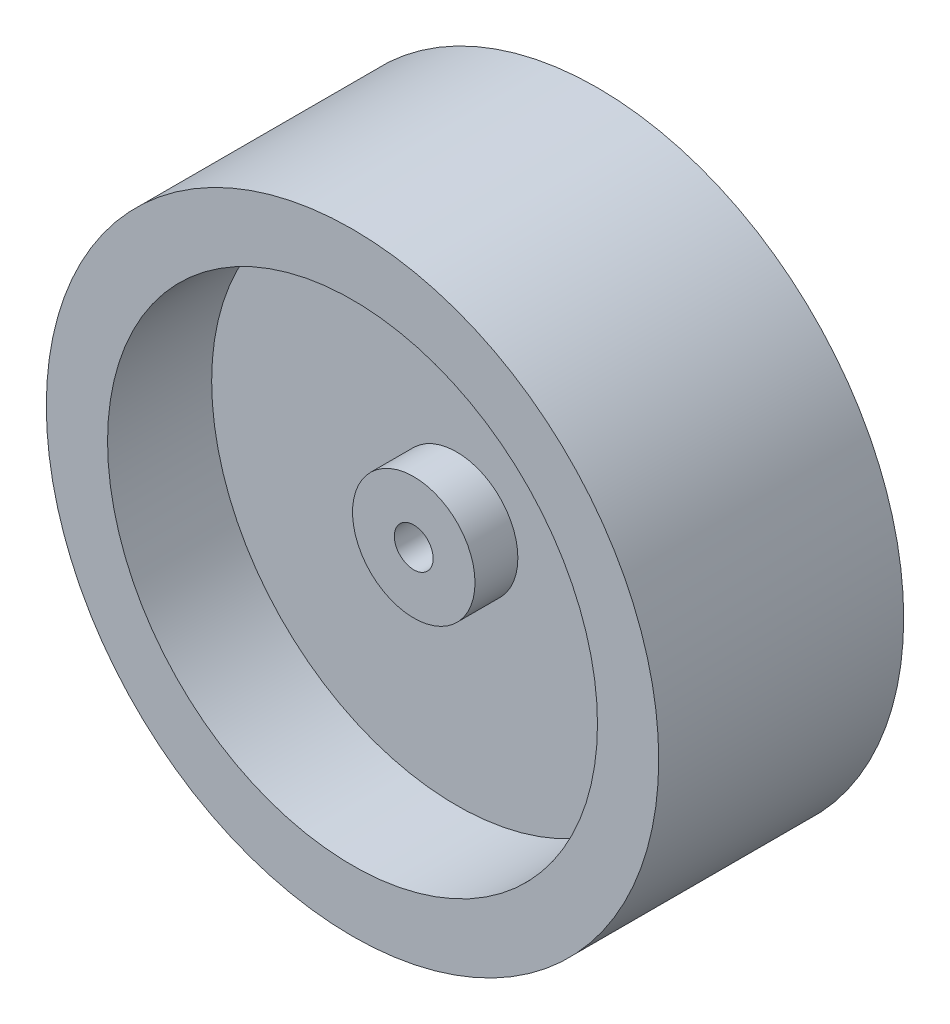
ISO-10303-21;
HEADER;
FILE_DESCRIPTION(('STEP AP214'),'2;1');
FILE_NAME('part.step','',(''),(''),'','','');
FILE_SCHEMA(('AUTOMOTIVE_DESIGN { 1 0 10303 214 1 1 1 1 }'));
ENDSEC;
DATA;
#1=APPLICATION_CONTEXT('core data for automotive mechanical design processes');
#2=APPLICATION_PROTOCOL_DEFINITION('international standard','automotive_design',2000,#1);
#3=PRODUCT_CONTEXT('',#1,'mechanical');
#4=PRODUCT('Part','Part','',(#3));
#5=PRODUCT_RELATED_PRODUCT_CATEGORY('part','',(#4));
#6=PRODUCT_DEFINITION_FORMATION('','',#4);
#7=PRODUCT_DEFINITION_CONTEXT('part definition',#1,'design');
#8=PRODUCT_DEFINITION('design','',#6,#7);
#9=PRODUCT_DEFINITION_SHAPE('','',#8);
#10=(LENGTH_UNIT() NAMED_UNIT(*) SI_UNIT(.MILLI.,.METRE.));
#11=(NAMED_UNIT(*) PLANE_ANGLE_UNIT() SI_UNIT($,.RADIAN.));
#12=(NAMED_UNIT(*) SI_UNIT($,.STERADIAN.) SOLID_ANGLE_UNIT());
#13=UNCERTAINTY_MEASURE_WITH_UNIT(LENGTH_MEASURE(1.E-05),#10,'distance_accuracy_value','');
#14=(GEOMETRIC_REPRESENTATION_CONTEXT(3) GLOBAL_UNCERTAINTY_ASSIGNED_CONTEXT((#13)) GLOBAL_UNIT_ASSIGNED_CONTEXT((#10,
#11,#12)) REPRESENTATION_CONTEXT('',''));
#15=CARTESIAN_POINT('',(0.,0.,0.));
#16=DIRECTION('',(0.,0.,1.));
#17=DIRECTION('',(1.,0.,0.));
#18=AXIS2_PLACEMENT_3D('',#15,#16,#17);
#19=CARTESIAN_POINT('',(0.,0.,1.5));
#20=DIRECTION('',(0.,0.,1.));
#21=DIRECTION('',(1.,0.,0.));
#22=AXIS2_PLACEMENT_3D('',#19,#20,#21);
#23=PLANE('',#22);
#24=CARTESIAN_POINT('',(0.,0.,1.5));
#25=DIRECTION('',(0.,0.,1.));
#26=DIRECTION('',(1.,0.,0.));
#27=AXIS2_PLACEMENT_3D('',#24,#25,#26);
#28=CIRCLE('',#27,5.);
#29=CARTESIAN_POINT('',(5.,0.,1.5));
#30=VERTEX_POINT('',#29);
#31=EDGE_CURVE('E58',#30,#30,#28,.F.);
#32=ORIENTED_EDGE('',*,*,#31,.T.);
#33=EDGE_LOOP('',(#32));
#34=FACE_BOUND('',#33,.T.);
#35=CARTESIAN_POINT('',(0.,0.,1.5));
#36=DIRECTION('',(0.,0.,1.));
#37=DIRECTION('',(1.,0.,0.));
#38=AXIS2_PLACEMENT_3D('',#35,#36,#37);
#39=CIRCLE('',#38,20.);
#40=CARTESIAN_POINT('',(20.,0.,1.5));
#41=VERTEX_POINT('',#40);
#42=EDGE_CURVE('E38',#41,#41,#39,.F.);
#43=ORIENTED_EDGE('',*,*,#42,.F.);
#44=EDGE_LOOP('',(#43));
#45=FACE_BOUND('',#44,.T.);
#46=ADVANCED_FACE('F31',(#34,#45),#23,.T.);
#47=CARTESIAN_POINT('',(0.,0.,10.));
#48=DIRECTION('',(0.,0.,1.));
#49=DIRECTION('',(1.,0.,0.));
#50=AXIS2_PLACEMENT_3D('',#47,#48,#49);
#51=PLANE('',#50);
#52=CARTESIAN_POINT('',(0.,0.,10.));
#53=DIRECTION('',(0.,0.,1.));
#54=DIRECTION('',(1.,0.,0.));
#55=AXIS2_PLACEMENT_3D('',#52,#53,#54);
#56=CIRCLE('',#55,25.);
#57=CARTESIAN_POINT('',(25.,0.,10.));
#58=VERTEX_POINT('',#57);
#59=EDGE_CURVE('E47',#58,#58,#56,.T.);
#60=ORIENTED_EDGE('',*,*,#59,.T.);
#61=EDGE_LOOP('',(#60));
#62=FACE_BOUND('',#61,.T.);
#63=CARTESIAN_POINT('',(0.,0.,10.));
#64=DIRECTION('',(0.,0.,1.));
#65=DIRECTION('',(1.,0.,0.));
#66=AXIS2_PLACEMENT_3D('',#63,#64,#65);
#67=CIRCLE('',#66,20.);
#68=CARTESIAN_POINT('',(20.,0.,10.));
#69=VERTEX_POINT('',#68);
#70=EDGE_CURVE('E52',#69,#69,#67,.T.);
#71=ORIENTED_EDGE('',*,*,#70,.F.);
#72=EDGE_LOOP('',(#71));
#73=FACE_BOUND('',#72,.T.);
#74=ADVANCED_FACE('F97',(#62,#73),#51,.T.);
#75=CARTESIAN_POINT('',(0.,0.,10.));
#76=DIRECTION('',(0.,0.,-1.));
#77=DIRECTION('',(-1.,0.,0.));
#78=AXIS2_PLACEMENT_3D('',#75,#76,#77);
#79=CYLINDRICAL_SURFACE('',#78,20.);
#80=ORIENTED_EDGE('',*,*,#42,.T.);
#81=EDGE_LOOP('',(#80));
#82=FACE_BOUND('',#81,.T.);
#83=ORIENTED_EDGE('',*,*,#70,.T.);
#84=EDGE_LOOP('',(#83));
#85=FACE_BOUND('',#84,.T.);
#86=ADVANCED_FACE('F103',(#82,#85),#79,.F.);
#87=CARTESIAN_POINT('',(0.,0.,1.5));
#88=DIRECTION('',(0.,0.,-1.));
#89=DIRECTION('',(-1.,0.,0.));
#90=AXIS2_PLACEMENT_3D('',#87,#88,#89);
#91=CYLINDRICAL_SURFACE('',#90,25.);
#92=CARTESIAN_POINT('',(0.,0.,-10.));
#93=DIRECTION('',(0.,0.,1.));
#94=DIRECTION('',(1.,0.,0.));
#95=AXIS2_PLACEMENT_3D('',#92,#93,#94);
#96=CIRCLE('',#95,25.);
#97=CARTESIAN_POINT('',(25.,0.,-10.));
#98=VERTEX_POINT('',#97);
#99=EDGE_CURVE('E49',#98,#98,#96,.T.);
#100=ORIENTED_EDGE('',*,*,#99,.T.);
#101=EDGE_LOOP('',(#100));
#102=FACE_BOUND('',#101,.T.);
#103=ORIENTED_EDGE('',*,*,#59,.F.);
#104=EDGE_LOOP('',(#103));
#105=FACE_BOUND('',#104,.T.);
#106=ADVANCED_FACE('F33',(#102,#105),#91,.T.);
#107=CARTESIAN_POINT('',(0.,0.,-10.));
#108=DIRECTION('',(0.,0.,1.));
#109=DIRECTION('',(1.,0.,0.));
#110=AXIS2_PLACEMENT_3D('',#107,#108,#109);
#111=PLANE('',#110);
#112=ORIENTED_EDGE('',*,*,#99,.F.);
#113=EDGE_LOOP('',(#112));
#114=FACE_BOUND('',#113,.T.);
#115=CARTESIAN_POINT('',(0.,0.,-10.));
#116=DIRECTION('',(0.,0.,1.));
#117=DIRECTION('',(1.,0.,0.));
#118=AXIS2_PLACEMENT_3D('',#115,#116,#117);
#119=CIRCLE('',#118,20.);
#120=CARTESIAN_POINT('',(20.,0.,-10.));
#121=VERTEX_POINT('',#120);
#122=EDGE_CURVE('E55',#121,#121,#119,.T.);
#123=ORIENTED_EDGE('',*,*,#122,.T.);
#124=EDGE_LOOP('',(#123));
#125=FACE_BOUND('',#124,.T.);
#126=ADVANCED_FACE('F108',(#114,#125),#111,.F.);
#127=ORIENTED_EDGE('',*,*,#122,.F.);
#128=EDGE_LOOP('',(#127));
#129=FACE_BOUND('',#128,.T.);
#130=CARTESIAN_POINT('',(0.,0.,-1.5));
#131=DIRECTION('',(0.,0.,1.));
#132=DIRECTION('',(1.,0.,0.));
#133=AXIS2_PLACEMENT_3D('',#130,#131,#132);
#134=CIRCLE('',#133,20.);
#135=CARTESIAN_POINT('',(20.,0.,-1.5));
#136=VERTEX_POINT('',#135);
#137=EDGE_CURVE('E42',#136,#136,#134,.F.);
#138=ORIENTED_EDGE('',*,*,#137,.F.);
#139=EDGE_LOOP('',(#138));
#140=FACE_BOUND('',#139,.T.);
#141=ADVANCED_FACE('F110',(#129,#140),#79,.F.);
#142=CARTESIAN_POINT('',(0.,0.,-1.5));
#143=DIRECTION('',(0.,0.,1.));
#144=DIRECTION('',(1.,0.,0.));
#145=AXIS2_PLACEMENT_3D('',#142,#143,#144);
#146=PLANE('',#145);
#147=CARTESIAN_POINT('',(0.,0.,-1.5));
#148=DIRECTION('',(0.,0.,1.));
#149=DIRECTION('',(1.,0.,0.));
#150=AXIS2_PLACEMENT_3D('',#147,#148,#149);
#151=CIRCLE('',#150,5.);
#152=CARTESIAN_POINT('',(5.,0.,-1.5));
#153=VERTEX_POINT('',#152);
#154=EDGE_CURVE('E10',#153,#153,#151,.F.);
#155=ORIENTED_EDGE('',*,*,#154,.F.);
#156=EDGE_LOOP('',(#155));
#157=FACE_BOUND('',#156,.T.);
#158=ORIENTED_EDGE('',*,*,#137,.T.);
#159=EDGE_LOOP('',(#158));
#160=FACE_BOUND('',#159,.T.);
#161=ADVANCED_FACE('F83',(#157,#160),#146,.F.);
#162=CARTESIAN_POINT('',(0.,0.,-5.));
#163=DIRECTION('',(0.,0.,1.));
#164=DIRECTION('',(1.,0.,0.));
#165=AXIS2_PLACEMENT_3D('',#162,#163,#164);
#166=PLANE('',#165);
#167=CARTESIAN_POINT('',(0.,0.,-5.));
#168=DIRECTION('',(0.,0.,-1.));
#169=DIRECTION('',(-1.,0.,0.));
#170=AXIS2_PLACEMENT_3D('',#167,#168,#169);
#171=CIRCLE('',#170,1.585);
#172=CARTESIAN_POINT('',(-1.585,0.,-5.));
#173=VERTEX_POINT('',#172);
#174=EDGE_CURVE('E72',#173,#173,#171,.T.);
#175=ORIENTED_EDGE('',*,*,#174,.F.);
#176=EDGE_LOOP('',(#175));
#177=FACE_BOUND('',#176,.T.);
#178=CARTESIAN_POINT('',(0.,0.,-5.));
#179=DIRECTION('',(0.,0.,1.));
#180=DIRECTION('',(1.,0.,0.));
#181=AXIS2_PLACEMENT_3D('',#178,#179,#180);
#182=CIRCLE('',#181,5.);
#183=CARTESIAN_POINT('',(5.,0.,-5.));
#184=VERTEX_POINT('',#183);
#185=EDGE_CURVE('E64',#184,#184,#182,.T.);
#186=ORIENTED_EDGE('',*,*,#185,.F.);
#187=EDGE_LOOP('',(#186));
#188=FACE_BOUND('',#187,.T.);
#189=ADVANCED_FACE('F79',(#177,#188),#166,.F.);
#190=CARTESIAN_POINT('',(0.,0.,5.));
#191=DIRECTION('',(0.,0.,-1.));
#192=DIRECTION('',(-1.,0.,0.));
#193=AXIS2_PLACEMENT_3D('',#190,#191,#192);
#194=CYLINDRICAL_SURFACE('',#193,5.);
#195=ORIENTED_EDGE('',*,*,#185,.T.);
#196=EDGE_LOOP('',(#195));
#197=FACE_BOUND('',#196,.T.);
#198=ORIENTED_EDGE('',*,*,#154,.T.);
#199=EDGE_LOOP('',(#198));
#200=FACE_BOUND('',#199,.T.);
#201=ADVANCED_FACE('F82',(#197,#200),#194,.T.);
#202=ORIENTED_EDGE('',*,*,#31,.F.);
#203=EDGE_LOOP('',(#202));
#204=FACE_BOUND('',#203,.T.);
#205=CARTESIAN_POINT('',(0.,0.,5.));
#206=DIRECTION('',(0.,0.,1.));
#207=DIRECTION('',(1.,0.,0.));
#208=AXIS2_PLACEMENT_3D('',#205,#206,#207);
#209=CIRCLE('',#208,5.);
#210=CARTESIAN_POINT('',(5.,0.,5.));
#211=VERTEX_POINT('',#210);
#212=EDGE_CURVE('E63',#211,#211,#209,.T.);
#213=ORIENTED_EDGE('',*,*,#212,.F.);
#214=EDGE_LOOP('',(#213));
#215=FACE_BOUND('',#214,.T.);
#216=ADVANCED_FACE('F88',(#204,#215),#194,.T.);
#217=CARTESIAN_POINT('',(0.,0.,5.));
#218=DIRECTION('',(0.,0.,1.));
#219=DIRECTION('',(1.,0.,0.));
#220=AXIS2_PLACEMENT_3D('',#217,#218,#219);
#221=PLANE('',#220);
#222=CARTESIAN_POINT('',(0.,0.,5.));
#223=DIRECTION('',(0.,0.,1.));
#224=DIRECTION('',(1.,0.,0.));
#225=AXIS2_PLACEMENT_3D('',#222,#223,#224);
#226=CIRCLE('',#225,1.585);
#227=CARTESIAN_POINT('',(1.585,0.,5.));
#228=VERTEX_POINT('',#227);
#229=EDGE_CURVE('E67',#228,#228,#226,.F.);
#230=ORIENTED_EDGE('',*,*,#229,.T.);
#231=EDGE_LOOP('',(#230));
#232=FACE_BOUND('',#231,.T.);
#233=ORIENTED_EDGE('',*,*,#212,.T.);
#234=EDGE_LOOP('',(#233));
#235=FACE_BOUND('',#234,.T.);
#236=ADVANCED_FACE('F93',(#232,#235),#221,.T.);
#237=CARTESIAN_POINT('',(0.,0.,9.48305699272271));
#238=DIRECTION('',(0.,0.,-1.));
#239=DIRECTION('',(-1.,0.,0.));
#240=AXIS2_PLACEMENT_3D('',#237,#238,#239);
#241=CYLINDRICAL_SURFACE('',#240,1.585);
#242=ORIENTED_EDGE('',*,*,#174,.T.);
#243=EDGE_LOOP('',(#242));
#244=FACE_BOUND('',#243,.T.);
#245=ORIENTED_EDGE('',*,*,#229,.F.);
#246=EDGE_LOOP('',(#245));
#247=FACE_BOUND('',#246,.T.);
#248=ADVANCED_FACE('F76',(#244,#247),#241,.F.);
#249=CLOSED_SHELL('',(#46,#74,#86,#106,#126,#141,#161,#189,#201,#216,#236,#248));
#250=MANIFOLD_SOLID_BREP('B2',#249);
#251=ADVANCED_BREP_SHAPE_REPRESENTATION('',(#18,#250),#14);
#252=SHAPE_DEFINITION_REPRESENTATION(#9,#251);
ENDSEC;
END-ISO-10303-21;
